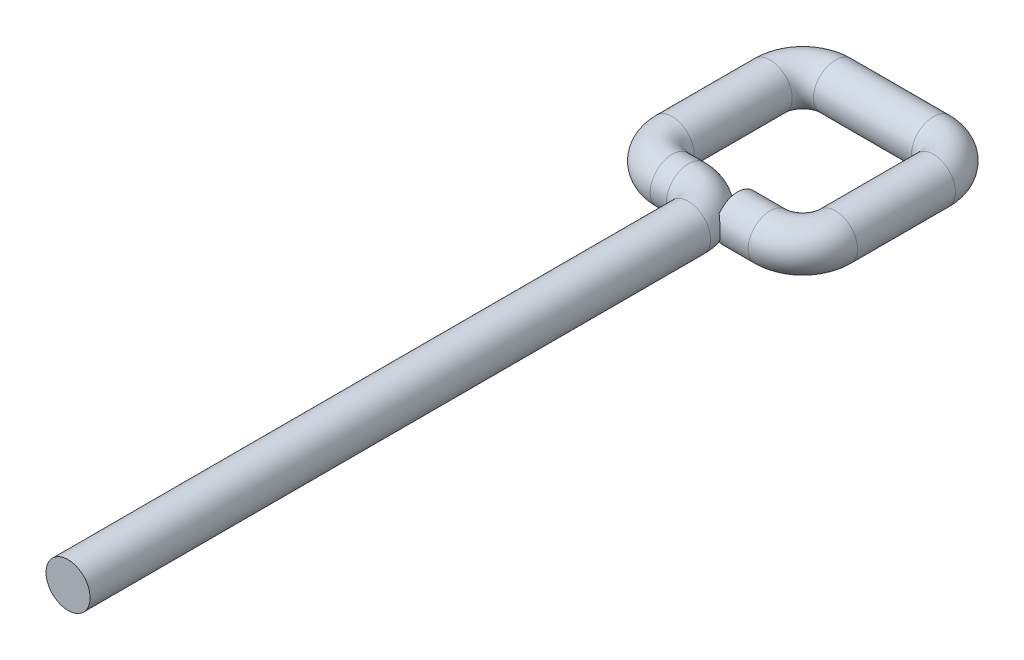
ISO-10303-21;
HEADER;
FILE_DESCRIPTION(('STEP AP214'),'2;1');
FILE_NAME('part.step','',(''),(''),'','','');
FILE_SCHEMA(('AUTOMOTIVE_DESIGN { 1 0 10303 214 1 1 1 1 }'));
ENDSEC;
DATA;
#1=APPLICATION_CONTEXT('core data for automotive mechanical design processes');
#2=APPLICATION_PROTOCOL_DEFINITION('international standard','automotive_design',2000,#1);
#3=PRODUCT_CONTEXT('',#1,'mechanical');
#4=PRODUCT('Part','Part','',(#3));
#5=PRODUCT_RELATED_PRODUCT_CATEGORY('part','',(#4));
#6=PRODUCT_DEFINITION_FORMATION('','',#4);
#7=PRODUCT_DEFINITION_CONTEXT('part definition',#1,'design');
#8=PRODUCT_DEFINITION('design','',#6,#7);
#9=PRODUCT_DEFINITION_SHAPE('','',#8);
#10=(LENGTH_UNIT() NAMED_UNIT(*) SI_UNIT(.MILLI.,.METRE.));
#11=(NAMED_UNIT(*) PLANE_ANGLE_UNIT() SI_UNIT($,.RADIAN.));
#12=(NAMED_UNIT(*) SI_UNIT($,.STERADIAN.) SOLID_ANGLE_UNIT());
#13=UNCERTAINTY_MEASURE_WITH_UNIT(LENGTH_MEASURE(1.E-05),#10,'distance_accuracy_value','');
#14=(GEOMETRIC_REPRESENTATION_CONTEXT(3) GLOBAL_UNCERTAINTY_ASSIGNED_CONTEXT((#13)) GLOBAL_UNIT_ASSIGNED_CONTEXT((#10,
#11,#12)) REPRESENTATION_CONTEXT('',''));
#15=CARTESIAN_POINT('',(0.,0.,0.));
#16=DIRECTION('',(0.,0.,1.));
#17=DIRECTION('',(1.,0.,0.));
#18=AXIS2_PLACEMENT_3D('',#15,#16,#17);
#19=CARTESIAN_POINT('',(0.,0.,0.));
#20=DIRECTION('',(0.,0.,-1.));
#21=DIRECTION('',(-1.,0.,0.));
#22=AXIS2_PLACEMENT_3D('',#19,#20,#21);
#23=PLANE('',#22);
#24=CARTESIAN_POINT('',(0.,0.,0.));
#25=DIRECTION('',(0.,0.,-1.));
#26=DIRECTION('',(-1.,0.,0.));
#27=AXIS2_PLACEMENT_3D('',#24,#25,#26);
#28=CIRCLE('',#27,1.35);
#29=CARTESIAN_POINT('',(-1.35,0.,0.));
#30=VERTEX_POINT('',#29);
#31=EDGE_CURVE('E69',#30,#30,#28,.T.);
#32=ORIENTED_EDGE('',*,*,#31,.F.);
#33=EDGE_LOOP('',(#32));
#34=FACE_BOUND('',#33,.T.);
#35=ADVANCED_FACE('F44',(#34),#23,.F.);
#36=CARTESIAN_POINT('',(1.,0.,-40.));
#37=DIRECTION('',(-1.,0.,0.));
#38=DIRECTION('',(0.,0.,1.));
#39=AXIS2_PLACEMENT_3D('',#36,#37,#38);
#40=PLANE('',#39);
#41=CARTESIAN_POINT('',(1.,0.,-39.4908051515876));
#42=CARTESIAN_POINT('',(1.,-0.0352296590022916,-39.4908017473813));
#43=CARTESIAN_POINT('',(1.,-0.0704885506020756,-39.487682290191));
#44=CARTESIAN_POINT('',(1.,-0.139959201644548,-39.4754241170436));
#45=CARTESIAN_POINT('',(1.,-0.174169545513383,-39.4662776092252));
#46=CARTESIAN_POINT('',(1.,-0.240466282518302,-39.4426495145446));
#47=CARTESIAN_POINT('',(1.,-0.27256307809386,-39.4281967893045));
#48=CARTESIAN_POINT('',(1.,-0.334275261700445,-39.3947658660494));
#49=CARTESIAN_POINT('',(1.,-0.36389006194763,-39.3757866001327));
#50=CARTESIAN_POINT('',(1.,-0.433866374217909,-39.3241772607224));
#51=CARTESIAN_POINT('',(1.,-0.472612529281817,-39.289354928908));
#52=CARTESIAN_POINT('',(1.,-0.544047055463802,-39.2139720652638));
#53=CARTESIAN_POINT('',(1.,-0.576720873456755,-39.1733981486529));
#54=CARTESIAN_POINT('',(1.,-0.651556287046423,-39.0667003812746));
#55=CARTESIAN_POINT('',(1.,-0.690112233965232,-38.9980635379855));
#56=CARTESIAN_POINT('',(1.,-0.75633094825054,-38.8557846959508));
#57=CARTESIAN_POINT('',(1.,-0.783972108008324,-38.7821331041017));
#58=CARTESIAN_POINT('',(1.,-0.825957772147634,-38.6456313141283));
#59=CARTESIAN_POINT('',(1.,-0.841801115118793,-38.5832279585135));
#60=CARTESIAN_POINT('',(1.,-0.868104128537316,-38.4572687355209));
#61=CARTESIAN_POINT('',(1.,-0.878560165366992,-38.3937121201283));
#62=CARTESIAN_POINT('',(1.,-0.894615624032672,-38.2657811389574));
#63=CARTESIAN_POINT('',(1.,-0.900198395847373,-38.2014047262396));
#64=CARTESIAN_POINT('',(1.,-0.906727576991478,-38.0724156552658));
#65=CARTESIAN_POINT('',(1.,-0.907673538021946,-38.0078029747713));
#66=CARTESIAN_POINT('',(1.,-0.904901670374231,-37.8750472421626));
#67=CARTESIAN_POINT('',(1.,-0.900919254655636,-37.8069094634991));
#68=CARTESIAN_POINT('',(1.,-0.88761011553663,-37.6711126329412));
#69=CARTESIAN_POINT('',(1.,-0.87828072281148,-37.6034538372568));
#70=CARTESIAN_POINT('',(1.,-0.853825493676174,-37.4695673848057));
#71=CARTESIAN_POINT('',(1.,-0.838732735088748,-37.4033337985441));
#72=CARTESIAN_POINT('',(1.,-0.801960852443933,-37.272764782724));
#73=CARTESIAN_POINT('',(1.,-0.780290468969258,-37.2084269577296));
#74=CARTESIAN_POINT('',(1.,-0.733088132698466,-37.0922180498219));
#75=CARTESIAN_POINT('',(1.,-0.708617782950217,-37.0399211292179));
#76=CARTESIAN_POINT('',(1.,-0.653286674111354,-36.938679244952));
#77=CARTESIAN_POINT('',(1.,-0.622419316121285,-36.8897378126125));
#78=CARTESIAN_POINT('',(1.,-0.553065965211655,-36.7964507389175));
#79=CARTESIAN_POINT('',(1.,-0.514483599470617,-36.7521753174835));
#80=CARTESIAN_POINT('',(1.,-0.429527178075797,-36.6718602733164));
#81=CARTESIAN_POINT('',(1.,-0.38318144167094,-36.6357918020848));
#82=CARTESIAN_POINT('',(1.,-0.301866462718689,-36.5866348375655));
#83=CARTESIAN_POINT('',(1.,-0.269044509753497,-36.5699834541044));
#84=CARTESIAN_POINT('',(1.,-0.201100134247118,-36.5422868559155));
#85=CARTESIAN_POINT('',(1.,-0.165979421120299,-36.5312375276577));
#86=CARTESIAN_POINT('',(1.,-0.0941297588460124,-36.5154799986322));
#87=CARTESIAN_POINT('',(1.,-0.0573933320008975,-36.5108054062161));
#88=CARTESIAN_POINT('',(1.,0.0163145164414685,-36.508286605804));
#89=CARTESIAN_POINT('',(1.,0.053285901933683,-36.5104413725435));
#90=CARTESIAN_POINT('',(1.,0.123391283240878,-36.5209713652611));
#91=CARTESIAN_POINT('',(1.,0.156601337088988,-36.5288540738095));
#92=CARTESIAN_POINT('',(1.,0.22134660748975,-36.5497615439855));
#93=CARTESIAN_POINT('',(1.,0.252881537576195,-36.5627871819242));
#94=CARTESIAN_POINT('',(1.,0.315628879785887,-36.5942289165974));
#95=CARTESIAN_POINT('',(1.,0.346695653509973,-36.6129330509947));
#96=CARTESIAN_POINT('',(1.,0.405949215377192,-36.6544243626499));
#97=CARTESIAN_POINT('',(1.,0.434134350769238,-36.6772138626499));
#98=CARTESIAN_POINT('',(1.,0.503982721053815,-36.7410818598206));
#99=CARTESIAN_POINT('',(1.,0.543255660237934,-36.7847797864602));
#100=CARTESIAN_POINT('',(1.,0.614427635237524,-36.877809508003));
#101=CARTESIAN_POINT('',(1.,0.646307313672333,-36.9271555983008));
#102=CARTESIAN_POINT('',(1.,0.719672959849849,-37.05850296063));
#103=CARTESIAN_POINT('',(1.,0.756365110360022,-37.143162852241));
#104=CARTESIAN_POINT('',(1.,0.816676051646273,-37.3170269846278));
#105=CARTESIAN_POINT('',(1.,0.84025648748108,-37.4062437327805));
#106=CARTESIAN_POINT('',(1.,0.872645238996268,-37.56751066609));
#107=CARTESIAN_POINT('',(1.,0.883532235184613,-37.639160625718));
#108=CARTESIAN_POINT('',(1.,0.89923260362508,-37.7831638101179));
#109=CARTESIAN_POINT('',(1.,0.904041775566927,-37.8555174864595));
#110=CARTESIAN_POINT('',(1.,0.907884392571691,-38.0003829061432));
#111=CARTESIAN_POINT('',(1.,0.906917163768911,-38.0728946669406));
#112=CARTESIAN_POINT('',(1.,0.899140831965862,-38.2175615941942));
#113=CARTESIAN_POINT('',(1.,0.892335263442826,-38.2897169498389));
#114=CARTESIAN_POINT('',(1.,0.869450130710624,-38.4550215169458));
#115=CARTESIAN_POINT('',(1.,0.851179750040671,-38.5478824784265));
#116=CARTESIAN_POINT('',(1.,0.802132146803767,-38.7301784379161));
#117=CARTESIAN_POINT('',(1.,0.771388537273492,-38.8196219420564));
#118=CARTESIAN_POINT('',(1.,0.707661437965135,-38.9621537696935));
#119=CARTESIAN_POINT('',(1.,0.679063975394867,-39.0171881310071));
#120=CARTESIAN_POINT('',(1.,0.614172297599954,-39.1225828891201));
#121=CARTESIAN_POINT('',(1.,0.577887812615786,-39.1729490801125));
#122=CARTESIAN_POINT('',(1.,0.507449741606167,-39.2540984682563));
#123=CARTESIAN_POINT('',(1.,0.475233405469829,-39.2865531207243));
#124=CARTESIAN_POINT('',(1.,0.406058630116805,-39.34599254727));
#125=CARTESIAN_POINT('',(1.,0.369105750456794,-39.3729836399448));
#126=CARTESIAN_POINT('',(1.,0.298240199833589,-39.4153195602814));
#127=CARTESIAN_POINT('',(1.,0.265068863195554,-39.4319008424495));
#128=CARTESIAN_POINT('',(1.,0.196449573732956,-39.4593111969292));
#129=CARTESIAN_POINT('',(1.,0.161006404111332,-39.4701519367713));
#130=CARTESIAN_POINT('',(1.,0.104383786700373,-39.4820642242173));
#131=CARTESIAN_POINT('',(1.,0.0836479949832672,-39.4853326964464));
#132=CARTESIAN_POINT('',(1.,0.0419449498418802,-39.4897043592238));
#133=CARTESIAN_POINT('',(1.,0.0209776573636195,-39.4908071786373));
#134=CARTESIAN_POINT('',(1.,0.,-39.4908051515876));
#135=B_SPLINE_CURVE_WITH_KNOTS('',3,(#41,#42,#43,#44,#45,#46,#47,#48,#49,#50,#51,#52,#53,#54,
#55,#56,#57,#58,#59,#60,#61,#62,#63,#64,#65,#66,#67,#68,#69,#70,#71,#72,#73,#74,#75,#76,#77,#78,
#79,#80,#81,#82,#83,#84,#85,#86,#87,#88,#89,#90,#91,#92,#93,#94,#95,#96,#97,#98,#99,#100,#101,
#102,#103,#104,#105,#106,#107,#108,#109,#110,#111,#112,#113,#114,#115,#116,#117,#118,#119,#120,
#121,#122,#123,#124,#125,#126,#127,#128,#129,#130,#131,#132,#133,#134),.UNSPECIFIED.,.T.,.F.,(4,
2,2,2,2,2,2,2,2,2,2,2,2,2,2,2,2,2,2,2,2,2,2,2,2,2,2,2,2,2,2,2,2,2,2,2,2,2,2,2,2,2,2,2,2,2,4),
(0.,0.10560709403815,0.211350987079333,0.316528037909199,0.421729926700498,0.577133017230976,
0.732903878847777,0.967763639184811,1.20308603950892,1.39597889677961,1.58900168622093,
1.78268140567068,1.97637985021064,2.18094361202026,2.38560958547776,2.58911815243691,
2.7923574651572,2.96521328784088,3.13824831728653,3.31359757461142,3.48832059191502,
3.59830576631553,3.70821006237185,3.81869157529432,3.92915650285248,4.0311027098204,
4.1330662950509,4.24145732648894,4.3499101804366,4.52515869056271,4.70086099081196,
4.97613098960759,5.25220203967183,5.46935056972834,5.6866490865714,5.90397295360792,
6.12116534754106,6.40440390297208,6.68688419981712,6.87246414918523,7.05781058001346,
7.19454321539163,7.33111680471471,7.44192879041297,7.55251468014603,7.61538812078002,
7.67827233529245),.UNSPECIFIED.);
#136=CARTESIAN_POINT('',(1.,0.746240577829966,-38.875));
#137=VERTEX_POINT('',#136);
#138=CARTESIAN_POINT('',(1.,-0.746240577830202,-38.8750000000002));
#139=VERTEX_POINT('',#138);
#140=EDGE_CURVE('E13',#137,#139,#135,.T.);
#141=ORIENTED_EDGE('',*,*,#140,.F.);
#142=CARTESIAN_POINT('',(1.,0.,-40.));
#143=DIRECTION('',(-1.,0.,0.));
#144=DIRECTION('',(0.,0.,1.));
#145=AXIS2_PLACEMENT_3D('',#142,#143,#144);
#146=CIRCLE('',#145,1.35);
#147=EDGE_CURVE('E61',#137,#139,#146,.T.);
#148=ORIENTED_EDGE('',*,*,#147,.T.);
#149=EDGE_LOOP('',(#141,#148));
#150=FACE_BOUND('',#149,.T.);
#151=ADVANCED_FACE('F118',(#150),#40,.T.);
#152=CARTESIAN_POINT('',(0.,0.,0.));
#153=DIRECTION('',(0.,0.,-1.));
#154=DIRECTION('',(-1.,0.,0.));
#155=AXIS2_PLACEMENT_3D('',#152,#153,#154);
#156=CYLINDRICAL_SURFACE('',#155,1.35);
#157=CARTESIAN_POINT('',(0.,0.,-38.));
#158=DIRECTION('',(0.,0.,-1.));
#159=DIRECTION('',(-1.,0.,0.));
#160=AXIS2_PLACEMENT_3D('',#157,#158,#159);
#161=CIRCLE('',#160,1.35);
#162=CARTESIAN_POINT('',(-1.35,0.,-38.));
#163=VERTEX_POINT('',#162);
#164=EDGE_CURVE('E71',#163,#163,#161,.T.);
#165=ORIENTED_EDGE('',*,*,#164,.F.);
#166=EDGE_LOOP('',(#165));
#167=FACE_BOUND('',#166,.T.);
#168=ORIENTED_EDGE('',*,*,#31,.T.);
#169=EDGE_LOOP('',(#168));
#170=FACE_BOUND('',#169,.T.);
#171=ADVANCED_FACE('F121',(#167,#170),#156,.T.);
#172=CARTESIAN_POINT('',(-2.,0.,-38.));
#173=DIRECTION('',(0.,1.,0.));
#174=DIRECTION('',(0.,0.,1.));
#175=AXIS2_PLACEMENT_3D('',#172,#173,#174);
#176=TOROIDAL_SURFACE('',#175,2.,1.35);
#177=CARTESIAN_POINT('',(-2.,1.35,-40.));
#178=CARTESIAN_POINT('',(-1.97891669763111,1.34999996875886,-40.0000000038378));
#179=CARTESIAN_POINT('',(-1.95783430331786,1.35000003148798,-39.9998333009439));
#180=CARTESIAN_POINT('',(-1.93335130005199,1.34999988737576,-39.9994461916631));
#181=CARTESIAN_POINT('',(-1.92994821945007,1.34999986247526,-39.9993880412647));
#182=CARTESIAN_POINT('',(-1.91293301536856,1.34999970771998,-39.9990755782022));
#183=CARTESIAN_POINT('',(-1.89932198691862,1.3499994871089,-39.9987561397807));
#184=CARTESIAN_POINT('',(-1.8776274093815,1.34999873085603,-39.9981362925097));
#185=CARTESIAN_POINT('',(-1.86954250410634,1.34999835941093,-39.9978807783589));
#186=CARTESIAN_POINT('',(-1.82911958542953,1.3499959024509,-39.996480694171));
#187=CARTESIAN_POINT('',(-1.79679305516819,1.3499920178736,-39.9949687606658));
#188=CARTESIAN_POINT('',(-1.74003089151715,1.349974760625,-39.9916268209728));
#189=CARTESIAN_POINT('',(-1.71558505513332,1.34996392066347,-39.9899631738689));
#190=CARTESIAN_POINT('',(-1.64226738642235,1.34991417959911,-39.9843020658736));
#191=CARTESIAN_POINT('',(-1.59344499591226,1.3498580496209,-39.9796356413053));
#192=CARTESIAN_POINT('',(-1.49598743215562,1.34964460855703,-39.9685435277166));
#193=CARTESIAN_POINT('',(-1.44735233018087,1.34948726217223,-39.9621172253896));
#194=CARTESIAN_POINT('',(-1.30077710043123,1.3487521834059,-39.9400869973756));
#195=CARTESIAN_POINT('',(-1.20322582625399,1.34790920177442,-39.9218141315373));
#196=CARTESIAN_POINT('',(-1.00960835905748,1.34470120754587,-39.8785632671988));
#197=CARTESIAN_POINT('',(-0.913542937206998,1.34233543006899,-39.8535819027872));
#198=CARTESIAN_POINT('',(-0.723131257946632,1.33500315510294,-39.7973362962263));
#199=CARTESIAN_POINT('',(-0.628789370986854,1.33003079871642,-39.7660579982013));
#200=CARTESIAN_POINT('',(-0.442481517868403,1.31621306015218,-39.6978511143896));
#201=CARTESIAN_POINT('',(-0.35051478629037,1.30736894260909,-39.6609243761149));
#202=CARTESIAN_POINT('',(-0.187941512964679,1.28671333763101,-39.5902042046022));
#203=CARTESIAN_POINT('',(-0.116816142039611,1.27587985920412,-39.5573166938477));
#204=CARTESIAN_POINT('',(0.02335271656226,1.25003351545105,-39.4888690560518));
#205=CARTESIAN_POINT('',(0.0923967270769109,1.23502170958198,-39.4533096081735));
#206=CARTESIAN_POINT('',(0.227856859696356,1.19997142809465,-39.3801534534365));
#207=CARTESIAN_POINT('',(0.29427958593184,1.1799466614748,-39.3425625184323));
#208=CARTESIAN_POINT('',(0.424129758934861,1.13388877343735,-39.2659758107465));
#209=CARTESIAN_POINT('',(0.487559250116416,1.10785982664236,-39.226981029964));
#210=CARTESIAN_POINT('',(0.617722486299152,1.04537505062529,-39.1440280834671));
#211=CARTESIAN_POINT('',(0.684018744170464,1.00807296182119,-39.1000073065926));
#212=CARTESIAN_POINT('',(0.810563809491948,0.923144160887753,-39.013090355684));
#213=CARTESIAN_POINT('',(0.87081672711616,0.875524536500521,-38.9701934321708));
#214=CARTESIAN_POINT('',(0.971454525208943,0.779599785076157,-38.8965563016738));
#215=CARTESIAN_POINT('',(1.01337638484119,0.73345232124927,-38.8651310080123));
#216=CARTESIAN_POINT('',(1.09033738098549,0.633399978407704,-38.8064113840936));
#217=CARTESIAN_POINT('',(1.12538733174728,0.579507523066413,-38.7791105789652));
#218=CARTESIAN_POINT('',(1.17976068082362,0.4771710430123,-38.7362114568934));
#219=CARTESIAN_POINT('',(1.20084811899244,0.430195803931818,-38.7193612239012));
#220=CARTESIAN_POINT('',(1.23661683770553,0.332425203503498,-38.6905790842751));
#221=CARTESIAN_POINT('',(1.25130214773868,0.281632268680675,-38.6786440842642));
#222=CARTESIAN_POINT('',(1.27341355809057,0.177102711759788,-38.6606112284359));
#223=CARTESIAN_POINT('',(1.280792375867,0.123349262193089,-38.6545513978302));
#224=CARTESIAN_POINT('',(1.28755940230404,0.015006095867155,-38.6489957844789));
#225=CARTESIAN_POINT('',(1.2869506307766,-0.0395832970568836,-38.6494975210473));
#226=CARTESIAN_POINT('',(1.27827579479124,-0.142076606499039,-38.6566151639667));
#227=CARTESIAN_POINT('',(1.27097809504852,-0.19009367739937,-38.6626010675006));
#228=CARTESIAN_POINT('',(1.25044287466488,-0.283959610069658,-38.6793407162342));
#229=CARTESIAN_POINT('',(1.23720461019168,-0.329808199523952,-38.6900950584995));
#230=CARTESIAN_POINT('',(1.20480276906968,-0.420285341980622,-38.7161887646467));
#231=CARTESIAN_POINT('',(1.18541361002504,-0.464781701106745,-38.7317017835299));
#232=CARTESIAN_POINT('',(1.14179810352099,-0.549857678883462,-38.7661977123425));
#233=CARTESIAN_POINT('',(1.11756929627038,-0.590435290176194,-38.7851823863529));
#234=CARTESIAN_POINT('',(1.05008638560545,-0.689479717348533,-38.8373325102729));
#235=CARTESIAN_POINT('',(1.00386892488018,-0.744929651123574,-38.8724049653627));
#236=CARTESIAN_POINT('',(0.904092581778205,-0.845999434551337,-38.9460944669953));
#237=CARTESIAN_POINT('',(0.850515202858533,-0.891593748112918,-38.9847203603963));
#238=CARTESIAN_POINT('',(0.708175632459581,-0.995632308928681,-39.0841426924356));
#239=CARTESIAN_POINT('',(0.615769688528361,-1.04815479090991,-39.1458792369058));
#240=CARTESIAN_POINT('',(0.422400236878377,-1.13660724661823,-39.2676735147226));
#241=CARTESIAN_POINT('',(0.321419165564476,-1.17250214399822,-39.3277274502553));
#242=CARTESIAN_POINT('',(0.147468929356879,-1.22179856429959,-39.4241595733057));
#243=CARTESIAN_POINT('',(0.0761722732939656,-1.23871629450351,-39.4618440162502));
#244=CARTESIAN_POINT('',(-0.068767041278005,-1.26779007481959,-39.5344499410129));
#245=CARTESIAN_POINT('',(-0.142410369151398,-1.27994475293211,-39.5693706244205));
#246=CARTESIAN_POINT('',(-0.366213484609347,-1.31067824660636,-39.6691156411688));
#247=CARTESIAN_POINT('',(-0.519413152172506,-1.3235686985287,-39.7290170789835));
#248=CARTESIAN_POINT('',(-0.759293667753729,-1.33663527292897,-39.8084646298049));
#249=CARTESIAN_POINT('',(-0.84396982827055,-1.33993441692001,-39.8338619337176));
#250=CARTESIAN_POINT('',(-1.01473903690983,-1.34481461397593,-39.8795675841646));
#251=CARTESIAN_POINT('',(-1.10083192455279,-1.3463958602938,-39.8998765029134));
#252=CARTESIAN_POINT('',(-1.29494246034406,-1.34881418289894,-39.9393041146277));
#253=CARTESIAN_POINT('',(-1.40326373722091,-1.34938162791748,-39.9569677186235));
#254=CARTESIAN_POINT('',(-1.57980308207948,-1.3498526809505,-39.9785030142671));
#255=CARTESIAN_POINT('',(-1.64770299222838,-1.34992613937774,-39.9850642002229));
#256=CARTESIAN_POINT('',(-1.75690645920961,-1.34998404204281,-39.9928251962742));
#257=CARTESIAN_POINT('',(-1.79813343259011,-1.3499921718259,-39.9951189608206));
#258=CARTESIAN_POINT('',(-1.87182956236546,-1.34999927662769,-39.9980781131667));
#259=CARTESIAN_POINT('',(-1.90428903126264,-1.34999983578386,-39.9989866237574));
#260=CARTESIAN_POINT('',(-1.95783468146135,-1.34999995391424,-39.9998333421587));
#261=CARTESIAN_POINT('',(-1.97891742327635,-1.34999979487312,-40.0000000924737));
#262=CARTESIAN_POINT('',(-2.,-1.35,-40.));
#263=B_SPLINE_CURVE_WITH_KNOTS('',3,(#177,#178,#179,#180,#181,#182,#183,#184,#185,#186,#187,
#188,#189,#190,#191,#192,#193,#194,#195,#196,#197,#198,#199,#200,#201,#202,#203,#204,#205,#206,
#207,#208,#209,#210,#211,#212,#213,#214,#215,#216,#217,#218,#219,#220,#221,#222,#223,#224,#225,
#226,#227,#228,#229,#230,#231,#232,#233,#234,#235,#236,#237,#238,#239,#240,#241,#242,#243,#244,
#245,#246,#247,#248,#249,#250,#251,#252,#253,#254,#255,#256,#257,#258,#259,#260,#261,#262),
.UNSPECIFIED.,.F.,.F.,(4,2,2,2,2,2,2,2,2,2,2,2,2,2,2,2,2,2,2,2,2,2,2,2,2,2,2,2,2,2,2,2,2,2,2,2,
2,2,2,2,2,2,4),(0.,0.0632475295960924,0.0734582549032042,0.114301654431678,0.138568454397491,
0.235642316570886,0.309146665816613,0.456244191028071,0.603393044208916,0.900869278606682,
1.19849504802715,1.49679268793225,1.79499296739198,2.03215158709438,2.26925012752971,
2.50570722288222,2.74200040583791,3.00501477260082,3.26784902846372,3.47659559215892,
3.68501096934597,3.84690749593616,4.00870197748812,4.17153676847282,4.33430999942254,
4.48045057877437,4.62660946184482,4.77890919175674,4.93128652713639,5.17068017335578,
5.4106868490697,5.77738688987876,6.14485701071117,6.39183090244829,6.63887588294178,
7.13238232439637,7.39764679423163,7.66288142034384,7.99176365273527,8.19633002676068,
8.32018310162468,8.41758986025383,8.48083738984994),.UNSPECIFIED.);
#264=EDGE_CURVE('E55',#139,#137,#263,.F.);
#265=ORIENTED_EDGE('',*,*,#264,.T.);
#266=ORIENTED_EDGE('',*,*,#140,.T.);
#267=EDGE_LOOP('',(#265,#266));
#268=FACE_BOUND('',#267,.T.);
#269=CARTESIAN_POINT('',(-2.00000000000001,0.,-40.));
#270=DIRECTION('',(-1.,0.,0.));
#271=DIRECTION('',(0.,0.,1.));
#272=AXIS2_PLACEMENT_3D('',#269,#270,#271);
#273=CIRCLE('',#272,1.35);
#274=CARTESIAN_POINT('',(-2.,0.,-38.65));
#275=VERTEX_POINT('',#274);
#276=EDGE_CURVE('E74',#275,#275,#273,.T.);
#277=ORIENTED_EDGE('',*,*,#276,.F.);
#278=EDGE_LOOP('',(#277));
#279=FACE_BOUND('',#278,.T.);
#280=ORIENTED_EDGE('',*,*,#164,.T.);
#281=EDGE_LOOP('',(#280));
#282=FACE_BOUND('',#281,.T.);
#283=ADVANCED_FACE('F108',(#268,#279,#282),#176,.T.);
#284=CARTESIAN_POINT('',(-2.00000000000001,0.,-40.));
#285=DIRECTION('',(-1.,0.,0.));
#286=DIRECTION('',(0.,0.,1.));
#287=AXIS2_PLACEMENT_3D('',#284,#285,#286);
#288=CYLINDRICAL_SURFACE('',#287,1.35);
#289=CARTESIAN_POINT('',(-2.99999999999999,0.,-40.));
#290=DIRECTION('',(-1.,0.,0.));
#291=DIRECTION('',(0.,0.,1.));
#292=AXIS2_PLACEMENT_3D('',#289,#290,#291);
#293=CIRCLE('',#292,1.35);
#294=CARTESIAN_POINT('',(-2.99999999999998,0.,-38.65));
#295=VERTEX_POINT('',#294);
#296=EDGE_CURVE('E79',#295,#295,#293,.T.);
#297=ORIENTED_EDGE('',*,*,#296,.F.);
#298=EDGE_LOOP('',(#297));
#299=FACE_BOUND('',#298,.T.);
#300=ORIENTED_EDGE('',*,*,#276,.T.);
#301=EDGE_LOOP('',(#300));
#302=FACE_BOUND('',#301,.T.);
#303=ADVANCED_FACE('F131',(#299,#302),#288,.T.);
#304=CARTESIAN_POINT('',(-3.,0.,-42.));
#305=DIRECTION('',(0.,-1.,0.));
#306=DIRECTION('',(0.,0.,-1.));
#307=AXIS2_PLACEMENT_3D('',#304,#305,#306);
#308=TOROIDAL_SURFACE('',#307,2.,1.35);
#309=CARTESIAN_POINT('',(-5.,0.,-42.));
#310=DIRECTION('',(0.,0.,-1.));
#311=DIRECTION('',(-1.,0.,0.));
#312=AXIS2_PLACEMENT_3D('',#309,#310,#311);
#313=CIRCLE('',#312,1.35);
#314=CARTESIAN_POINT('',(-6.35,0.,-42.));
#315=VERTEX_POINT('',#314);
#316=EDGE_CURVE('E82',#315,#315,#313,.T.);
#317=CARTESIAN_POINT('',(-3.,0.,-42.));
#318=DIRECTION('',(0.,-1.,0.));
#319=DIRECTION('',(0.,0.,-1.));
#320=AXIS2_PLACEMENT_3D('',#317,#318,#319);
#321=CIRCLE('',#320,3.35);
#322=EDGE_CURVE('',#295,#315,#321,.T.);
#323=ORIENTED_EDGE('',*,*,#296,.T.);
#324=ORIENTED_EDGE('',*,*,#316,.F.);
#325=ORIENTED_EDGE('',*,*,#322,.T.);
#326=ORIENTED_EDGE('',*,*,#322,.F.);
#327=EDGE_LOOP('',(#323,#325,#324,#326));
#328=FACE_BOUND('',#327,.T.);
#329=ADVANCED_FACE('F137',(#328),#308,.T.);
#330=CARTESIAN_POINT('',(-5.,0.,-42.));
#331=DIRECTION('',(0.,0.,-1.));
#332=DIRECTION('',(-1.,0.,0.));
#333=AXIS2_PLACEMENT_3D('',#330,#331,#332);
#334=CYLINDRICAL_SURFACE('',#333,1.35);
#335=CARTESIAN_POINT('',(-5.,0.,-48.));
#336=DIRECTION('',(0.,0.,-1.));
#337=DIRECTION('',(-1.,0.,0.));
#338=AXIS2_PLACEMENT_3D('',#335,#336,#337);
#339=CIRCLE('',#338,1.35);
#340=CARTESIAN_POINT('',(-6.35,0.,-48.));
#341=VERTEX_POINT('',#340);
#342=EDGE_CURVE('E85',#341,#341,#339,.T.);
#343=ORIENTED_EDGE('',*,*,#342,.F.);
#344=EDGE_LOOP('',(#343));
#345=FACE_BOUND('',#344,.T.);
#346=ORIENTED_EDGE('',*,*,#316,.T.);
#347=EDGE_LOOP('',(#346));
#348=FACE_BOUND('',#347,.T.);
#349=ADVANCED_FACE('F142',(#345,#348),#334,.T.);
#350=CARTESIAN_POINT('',(-3.,0.,-48.));
#351=DIRECTION('',(0.,-1.,0.));
#352=DIRECTION('',(0.,0.,-1.));
#353=AXIS2_PLACEMENT_3D('',#350,#351,#352);
#354=TOROIDAL_SURFACE('',#353,2.,1.35);
#355=CARTESIAN_POINT('',(-2.99999999999999,0.,-50.));
#356=DIRECTION('',(1.,0.,0.));
#357=DIRECTION('',(0.,0.,-1.));
#358=AXIS2_PLACEMENT_3D('',#355,#356,#357);
#359=CIRCLE('',#358,1.35);
#360=CARTESIAN_POINT('',(-2.99999999999998,0.,-51.35));
#361=VERTEX_POINT('',#360);
#362=EDGE_CURVE('E88',#361,#361,#359,.T.);
#363=CARTESIAN_POINT('',(-3.,0.,-48.));
#364=DIRECTION('',(0.,-1.,0.));
#365=DIRECTION('',(0.,0.,-1.));
#366=AXIS2_PLACEMENT_3D('',#363,#364,#365);
#367=CIRCLE('',#366,3.35);
#368=EDGE_CURVE('',#341,#361,#367,.T.);
#369=ORIENTED_EDGE('',*,*,#342,.T.);
#370=ORIENTED_EDGE('',*,*,#362,.F.);
#371=ORIENTED_EDGE('',*,*,#368,.T.);
#372=ORIENTED_EDGE('',*,*,#368,.F.);
#373=EDGE_LOOP('',(#369,#371,#370,#372));
#374=FACE_BOUND('',#373,.T.);
#375=ADVANCED_FACE('F149',(#374),#354,.T.);
#376=CARTESIAN_POINT('',(-2.99999999999999,0.,-50.));
#377=DIRECTION('',(1.,0.,0.));
#378=DIRECTION('',(0.,0.,-1.));
#379=AXIS2_PLACEMENT_3D('',#376,#377,#378);
#380=CYLINDRICAL_SURFACE('',#379,1.35);
#381=CARTESIAN_POINT('',(2.99999999999999,0.,-50.));
#382=DIRECTION('',(1.,0.,0.));
#383=DIRECTION('',(0.,0.,-1.));
#384=AXIS2_PLACEMENT_3D('',#381,#382,#383);
#385=CIRCLE('',#384,1.35);
#386=CARTESIAN_POINT('',(2.99999999999999,0.,-51.35));
#387=VERTEX_POINT('',#386);
#388=EDGE_CURVE('E91',#387,#387,#385,.T.);
#389=CARTESIAN_POINT('',(2.99999999999999,0.,-51.35));
#390=CARTESIAN_POINT('',(2.93749999999999,0.,-51.35));
#391=CARTESIAN_POINT('',(2.87499999999999,0.,-51.35));
#392=CARTESIAN_POINT('',(2.74999999999999,0.,-51.35));
#393=CARTESIAN_POINT('',(2.68749999999999,0.,-51.35));
#394=CARTESIAN_POINT('',(2.56249999999999,0.,-51.35));
#395=CARTESIAN_POINT('',(2.49999999999999,0.,-51.35));
#396=CARTESIAN_POINT('',(2.37499999999999,0.,-51.35));
#397=CARTESIAN_POINT('',(2.31249999999999,0.,-51.35));
#398=CARTESIAN_POINT('',(2.18749999999999,0.,-51.35));
#399=CARTESIAN_POINT('',(2.12499999999999,0.,-51.35));
#400=CARTESIAN_POINT('',(1.99999999999999,0.,-51.35));
#401=CARTESIAN_POINT('',(1.93749999999999,0.,-51.35));
#402=CARTESIAN_POINT('',(1.81249999999999,0.,-51.35));
#403=CARTESIAN_POINT('',(1.74999999999999,0.,-51.35));
#404=CARTESIAN_POINT('',(1.62499999999999,0.,-51.35));
#405=CARTESIAN_POINT('',(1.56249999999999,0.,-51.35));
#406=CARTESIAN_POINT('',(1.43749999999999,0.,-51.35));
#407=CARTESIAN_POINT('',(1.375,0.,-51.35));
#408=CARTESIAN_POINT('',(1.25,0.,-51.35));
#409=CARTESIAN_POINT('',(1.1875,0.,-51.35));
#410=CARTESIAN_POINT('',(1.0625,0.,-51.35));
#411=CARTESIAN_POINT('',(0.999999999999997,0.,-51.35));
#412=CARTESIAN_POINT('',(0.874999999999998,0.,-51.35));
#413=CARTESIAN_POINT('',(0.812499999999999,0.,-51.35));
#414=CARTESIAN_POINT('',(0.6875,0.,-51.35));
#415=CARTESIAN_POINT('',(0.625,0.,-51.35));
#416=CARTESIAN_POINT('',(0.500000000000001,0.,-51.35));
#417=CARTESIAN_POINT('',(0.437500000000001,0.,-51.35));
#418=CARTESIAN_POINT('',(0.312500000000002,0.,-51.35));
#419=CARTESIAN_POINT('',(0.250000000000002,0.,-51.35));
#420=CARTESIAN_POINT('',(0.125000000000003,0.,-51.35));
#421=CARTESIAN_POINT('',(0.0625000000000035,0.,-51.35));
#422=CARTESIAN_POINT('',(-0.0624999999999957,0.,-51.35));
#423=CARTESIAN_POINT('',(-0.124999999999995,0.,-51.35));
#424=CARTESIAN_POINT('',(-0.249999999999995,0.,-51.35));
#425=CARTESIAN_POINT('',(-0.312499999999994,0.,-51.35));
#426=CARTESIAN_POINT('',(-0.437499999999993,0.,-51.35));
#427=CARTESIAN_POINT('',(-0.499999999999993,0.,-51.35));
#428=CARTESIAN_POINT('',(-0.624999999999992,0.,-51.35));
#429=CARTESIAN_POINT('',(-0.687499999999992,0.,-51.35));
#430=CARTESIAN_POINT('',(-0.812499999999991,0.,-51.35));
#431=CARTESIAN_POINT('',(-0.87499999999999,0.,-51.35));
#432=CARTESIAN_POINT('',(-0.99999999999999,0.,-51.35));
#433=CARTESIAN_POINT('',(-1.06249999999999,0.,-51.35));
#434=CARTESIAN_POINT('',(-1.18749999999999,0.,-51.35));
#435=CARTESIAN_POINT('',(-1.24999999999999,0.,-51.35));
#436=CARTESIAN_POINT('',(-1.37499999999999,0.,-51.35));
#437=CARTESIAN_POINT('',(-1.43749999999999,0.,-51.35));
#438=CARTESIAN_POINT('',(-1.56249999999999,0.,-51.35));
#439=CARTESIAN_POINT('',(-1.62499999999999,0.,-51.35));
#440=CARTESIAN_POINT('',(-1.74999999999999,0.,-51.35));
#441=CARTESIAN_POINT('',(-1.81249999999998,0.,-51.35));
#442=CARTESIAN_POINT('',(-1.93749999999998,0.,-51.35));
#443=CARTESIAN_POINT('',(-1.99999999999998,0.,-51.35));
#444=CARTESIAN_POINT('',(-2.12499999999998,0.,-51.35));
#445=CARTESIAN_POINT('',(-2.18749999999998,0.,-51.35));
#446=CARTESIAN_POINT('',(-2.31249999999998,0.,-51.35));
#447=CARTESIAN_POINT('',(-2.37499999999998,0.,-51.35));
#448=CARTESIAN_POINT('',(-2.49999999999998,0.,-51.35));
#449=CARTESIAN_POINT('',(-2.56249999999998,0.,-51.35));
#450=CARTESIAN_POINT('',(-2.68749999999998,0.,-51.35));
#451=CARTESIAN_POINT('',(-2.74999999999998,0.,-51.35));
#452=CARTESIAN_POINT('',(-2.87499999999998,0.,-51.35));
#453=CARTESIAN_POINT('',(-2.93749999999998,0.,-51.35));
#454=CARTESIAN_POINT('',(-2.99999999999998,0.,-51.35));
#455=B_SPLINE_CURVE_WITH_KNOTS('',3,(#389,#390,#391,#392,#393,#394,#395,#396,#397,#398,#399,
#400,#401,#402,#403,#404,#405,#406,#407,#408,#409,#410,#411,#412,#413,#414,#415,#416,#417,#418,
#419,#420,#421,#422,#423,#424,#425,#426,#427,#428,#429,#430,#431,#432,#433,#434,#435,#436,#437,
#438,#439,#440,#441,#442,#443,#444,#445,#446,#447,#448,#449,#450,#451,#452,#453,#454),
.UNSPECIFIED.,.F.,.F.,(4,2,2,2,2,2,2,2,2,2,2,2,2,2,2,2,2,2,2,2,2,2,2,2,2,2,2,2,2,2,2,2,4),(0.,
0.187499999999998,0.374999999999998,0.562499999999997,0.749999999999995,0.937499999999994,
1.12499999999999,1.31249999999999,1.49999999999999,1.68749999999999,1.87499999999999,
2.06249999999999,2.24999999999999,2.43749999999998,2.62499999999998,2.81249999999998,
2.99999999999998,3.18749999999998,3.37499999999998,3.56249999999998,3.74999999999998,
3.93749999999998,4.12499999999998,4.31249999999997,4.49999999999997,4.68749999999997,
4.87499999999997,5.06249999999997,5.24999999999997,5.43749999999997,5.62499999999997,
5.81249999999997,5.99999999999996),.UNSPECIFIED.);
#456=EDGE_CURVE('BSEAM153',#387,#361,#455,.T.);
#457=ORIENTED_EDGE('',*,*,#388,.F.);
#458=ORIENTED_EDGE('',*,*,#362,.T.);
#459=ORIENTED_EDGE('',*,*,#456,.T.);
#460=ORIENTED_EDGE('',*,*,#456,.F.);
#461=EDGE_LOOP('',(#457,#459,#458,#460));
#462=FACE_BOUND('',#461,.T.);
#463=ADVANCED_FACE('F153',(#462),#380,.T.);
#464=CARTESIAN_POINT('',(3.,0.,-48.));
#465=DIRECTION('',(0.,-1.,0.));
#466=DIRECTION('',(0.,0.,-1.));
#467=AXIS2_PLACEMENT_3D('',#464,#465,#466);
#468=TOROIDAL_SURFACE('',#467,2.,1.35);
#469=CARTESIAN_POINT('',(5.,0.,-48.));
#470=DIRECTION('',(0.,0.,1.));
#471=DIRECTION('',(1.,0.,0.));
#472=AXIS2_PLACEMENT_3D('',#469,#470,#471);
#473=CIRCLE('',#472,1.35);
#474=CARTESIAN_POINT('',(6.35,0.,-48.));
#475=VERTEX_POINT('',#474);
#476=EDGE_CURVE('E94',#475,#475,#473,.T.);
#477=CARTESIAN_POINT('',(3.,0.,-48.));
#478=DIRECTION('',(0.,-1.,0.));
#479=DIRECTION('',(0.,0.,-1.));
#480=AXIS2_PLACEMENT_3D('',#477,#478,#479);
#481=CIRCLE('',#480,3.35);
#482=EDGE_CURVE('',#387,#475,#481,.T.);
#483=ORIENTED_EDGE('',*,*,#388,.T.);
#484=ORIENTED_EDGE('',*,*,#476,.F.);
#485=ORIENTED_EDGE('',*,*,#482,.T.);
#486=ORIENTED_EDGE('',*,*,#482,.F.);
#487=EDGE_LOOP('',(#483,#485,#484,#486));
#488=FACE_BOUND('',#487,.T.);
#489=ADVANCED_FACE('F157',(#488),#468,.T.);
#490=CARTESIAN_POINT('',(5.,0.,-48.));
#491=DIRECTION('',(0.,0.,1.));
#492=DIRECTION('',(1.,0.,0.));
#493=AXIS2_PLACEMENT_3D('',#490,#491,#492);
#494=CYLINDRICAL_SURFACE('',#493,1.35);
#495=CARTESIAN_POINT('',(5.,0.,-42.));
#496=DIRECTION('',(0.,0.,1.));
#497=DIRECTION('',(1.,0.,0.));
#498=AXIS2_PLACEMENT_3D('',#495,#496,#497);
#499=CIRCLE('',#498,1.35);
#500=CARTESIAN_POINT('',(6.35,0.,-42.));
#501=VERTEX_POINT('',#500);
#502=EDGE_CURVE('E97',#501,#501,#499,.T.);
#503=ORIENTED_EDGE('',*,*,#502,.F.);
#504=EDGE_LOOP('',(#503));
#505=FACE_BOUND('',#504,.T.);
#506=ORIENTED_EDGE('',*,*,#476,.T.);
#507=EDGE_LOOP('',(#506));
#508=FACE_BOUND('',#507,.T.);
#509=ADVANCED_FACE('F160',(#505,#508),#494,.T.);
#510=CARTESIAN_POINT('',(3.,0.,-42.));
#511=DIRECTION('',(0.,-1.,0.));
#512=DIRECTION('',(0.,0.,-1.));
#513=AXIS2_PLACEMENT_3D('',#510,#511,#512);
#514=TOROIDAL_SURFACE('',#513,2.,1.35);
#515=CARTESIAN_POINT('',(2.99999999999999,0.,-40.));
#516=DIRECTION('',(-1.,0.,0.));
#517=DIRECTION('',(0.,0.,1.));
#518=AXIS2_PLACEMENT_3D('',#515,#516,#517);
#519=CIRCLE('',#518,1.35);
#520=CARTESIAN_POINT('',(2.99999999999998,0.,-38.65));
#521=VERTEX_POINT('',#520);
#522=EDGE_CURVE('E100',#521,#521,#519,.T.);
#523=CARTESIAN_POINT('',(3.,0.,-42.));
#524=DIRECTION('',(0.,-1.,0.));
#525=DIRECTION('',(0.,0.,-1.));
#526=AXIS2_PLACEMENT_3D('',#523,#524,#525);
#527=CIRCLE('',#526,3.35);
#528=EDGE_CURVE('',#501,#521,#527,.T.);
#529=ORIENTED_EDGE('',*,*,#502,.T.);
#530=ORIENTED_EDGE('',*,*,#522,.F.);
#531=ORIENTED_EDGE('',*,*,#528,.T.);
#532=ORIENTED_EDGE('',*,*,#528,.F.);
#533=EDGE_LOOP('',(#529,#531,#530,#532));
#534=FACE_BOUND('',#533,.T.);
#535=ADVANCED_FACE('F116',(#534),#514,.T.);
#536=CARTESIAN_POINT('',(2.99999999999999,0.,-40.));
#537=DIRECTION('',(-1.,0.,0.));
#538=DIRECTION('',(0.,0.,1.));
#539=AXIS2_PLACEMENT_3D('',#536,#537,#538);
#540=CYLINDRICAL_SURFACE('',#539,1.35);
#541=ORIENTED_EDGE('',*,*,#264,.F.);
#542=ORIENTED_EDGE('',*,*,#147,.F.);
#543=EDGE_LOOP('',(#541,#542));
#544=FACE_BOUND('',#543,.T.);
#545=ORIENTED_EDGE('',*,*,#522,.T.);
#546=EDGE_LOOP('',(#545));
#547=FACE_BOUND('',#546,.T.);
#548=ADVANCED_FACE('F112',(#544,#547),#540,.T.);
#549=CLOSED_SHELL('',(#35,#151,#171,#283,#303,#329,#349,#375,#463,#489,#509,#535,#548));
#550=MANIFOLD_SOLID_BREP('B2',#549);
#551=ADVANCED_BREP_SHAPE_REPRESENTATION('',(#18,#550),#14);
#552=SHAPE_DEFINITION_REPRESENTATION(#9,#551);
ENDSEC;
END-ISO-10303-21;
